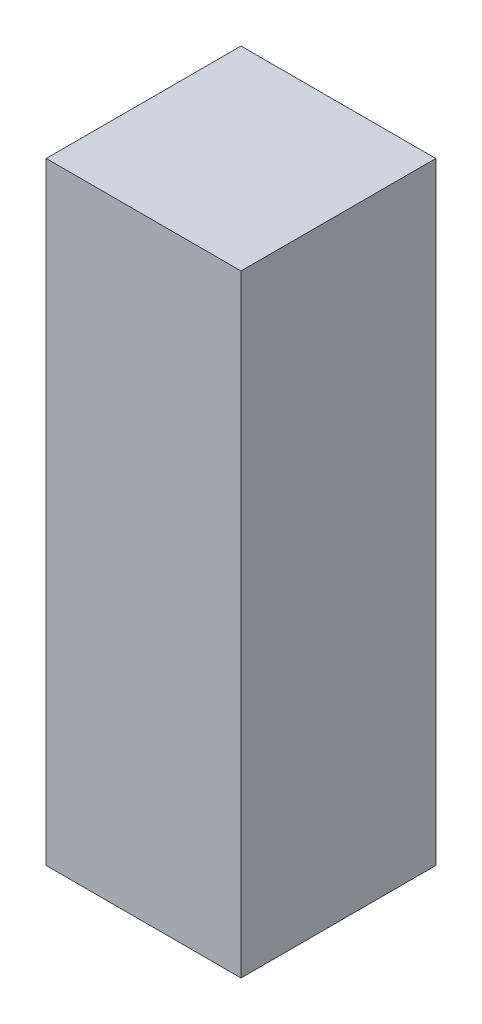
ISO-10303-21;
HEADER;
FILE_DESCRIPTION(('STEP AP214'),'2;1');
FILE_NAME('part.step','',(''),(''),'','','');
FILE_SCHEMA(('AUTOMOTIVE_DESIGN { 1 0 10303 214 1 1 1 1 }'));
ENDSEC;
DATA;
#1=APPLICATION_CONTEXT('core data for automotive mechanical design processes');
#2=APPLICATION_PROTOCOL_DEFINITION('international standard','automotive_design',2000,#1);
#3=PRODUCT_CONTEXT('',#1,'mechanical');
#4=PRODUCT('Part','Part','',(#3));
#5=PRODUCT_RELATED_PRODUCT_CATEGORY('part','',(#4));
#6=PRODUCT_DEFINITION_FORMATION('','',#4);
#7=PRODUCT_DEFINITION_CONTEXT('part definition',#1,'design');
#8=PRODUCT_DEFINITION('design','',#6,#7);
#9=PRODUCT_DEFINITION_SHAPE('','',#8);
#10=(LENGTH_UNIT() NAMED_UNIT(*) SI_UNIT(.MILLI.,.METRE.));
#11=(NAMED_UNIT(*) PLANE_ANGLE_UNIT() SI_UNIT($,.RADIAN.));
#12=(NAMED_UNIT(*) SI_UNIT($,.STERADIAN.) SOLID_ANGLE_UNIT());
#13=UNCERTAINTY_MEASURE_WITH_UNIT(LENGTH_MEASURE(1.E-05),#10,'distance_accuracy_value','');
#14=(GEOMETRIC_REPRESENTATION_CONTEXT(3) GLOBAL_UNCERTAINTY_ASSIGNED_CONTEXT((#13)) GLOBAL_UNIT_ASSIGNED_CONTEXT((#10,
#11,#12)) REPRESENTATION_CONTEXT('',''));
#15=CARTESIAN_POINT('',(0.,0.,0.));
#16=DIRECTION('',(0.,0.,1.));
#17=DIRECTION('',(1.,0.,0.));
#18=AXIS2_PLACEMENT_3D('',#15,#16,#17);
#19=CARTESIAN_POINT('',(0.35,2.2,-0.35));
#20=DIRECTION('',(-1.,0.,0.));
#21=DIRECTION('',(0.,0.,1.));
#22=AXIS2_PLACEMENT_3D('',#19,#20,#21);
#23=PLANE('',#22);
#24=DIRECTION('',(0.,0.,-1.));
#25=VECTOR('',#24,1.);
#26=CARTESIAN_POINT('',(0.35,0.,-0.35));
#27=LINE('',#26,#25);
#28=CARTESIAN_POINT('',(0.35,0.,0.35));
#29=VERTEX_POINT('',#28);
#30=CARTESIAN_POINT('',(0.35,0.,-0.35));
#31=VERTEX_POINT('',#30);
#32=EDGE_CURVE('E104',#29,#31,#27,.T.);
#33=ORIENTED_EDGE('',*,*,#32,.T.);
#34=DIRECTION('',(0.,-1.,0.));
#35=VECTOR('',#34,1.);
#36=CARTESIAN_POINT('',(0.35,2.2,-0.35));
#37=LINE('',#36,#35);
#38=CARTESIAN_POINT('',(0.35,2.2,-0.35));
#39=VERTEX_POINT('',#38);
#40=EDGE_CURVE('E11',#39,#31,#37,.T.);
#41=ORIENTED_EDGE('',*,*,#40,.F.);
#42=DIRECTION('',(0.,0.,-1.));
#43=VECTOR('',#42,1.);
#44=CARTESIAN_POINT('',(0.35,2.2,-0.35));
#45=LINE('',#44,#43);
#46=CARTESIAN_POINT('',(0.35,2.2,0.35));
#47=VERTEX_POINT('',#46);
#48=EDGE_CURVE('E92',#47,#39,#45,.T.);
#49=ORIENTED_EDGE('',*,*,#48,.F.);
#50=DIRECTION('',(0.,-1.,0.));
#51=VECTOR('',#50,1.);
#52=CARTESIAN_POINT('',(0.35,2.2,0.35));
#53=LINE('',#52,#51);
#54=EDGE_CURVE('E100',#47,#29,#53,.T.);
#55=ORIENTED_EDGE('',*,*,#54,.T.);
#56=EDGE_LOOP('',(#33,#41,#49,#55));
#57=FACE_BOUND('',#56,.T.);
#58=ADVANCED_FACE('F41',(#57),#23,.F.);
#59=CARTESIAN_POINT('',(-0.35,2.2,-0.35));
#60=DIRECTION('',(0.,0.,1.));
#61=DIRECTION('',(1.,0.,0.));
#62=AXIS2_PLACEMENT_3D('',#59,#60,#61);
#63=PLANE('',#62);
#64=DIRECTION('',(-1.,0.,0.));
#65=VECTOR('',#64,1.);
#66=CARTESIAN_POINT('',(-0.35,0.,-0.35));
#67=LINE('',#66,#65);
#68=CARTESIAN_POINT('',(-0.35,0.,-0.35));
#69=VERTEX_POINT('',#68);
#70=EDGE_CURVE('E96',#31,#69,#67,.T.);
#71=ORIENTED_EDGE('',*,*,#70,.T.);
#72=DIRECTION('',(0.,-1.,0.));
#73=VECTOR('',#72,1.);
#74=CARTESIAN_POINT('',(-0.35,2.2,-0.35));
#75=LINE('',#74,#73);
#76=CARTESIAN_POINT('',(-0.35,2.2,-0.35));
#77=VERTEX_POINT('',#76);
#78=EDGE_CURVE('E49',#77,#69,#75,.T.);
#79=ORIENTED_EDGE('',*,*,#78,.F.);
#80=DIRECTION('',(-1.,0.,0.));
#81=VECTOR('',#80,1.);
#82=CARTESIAN_POINT('',(-0.35,2.2,-0.35));
#83=LINE('',#82,#81);
#84=EDGE_CURVE('E87',#39,#77,#83,.T.);
#85=ORIENTED_EDGE('',*,*,#84,.F.);
#86=ORIENTED_EDGE('',*,*,#40,.T.);
#87=EDGE_LOOP('',(#71,#79,#85,#86));
#88=FACE_BOUND('',#87,.T.);
#89=ADVANCED_FACE('F95',(#88),#63,.F.);
#90=CARTESIAN_POINT('',(-0.35,2.2,-0.35));
#91=DIRECTION('',(1.,0.,0.));
#92=DIRECTION('',(0.,0.,-1.));
#93=AXIS2_PLACEMENT_3D('',#90,#91,#92);
#94=PLANE('',#93);
#95=DIRECTION('',(0.,0.,1.));
#96=VECTOR('',#95,1.);
#97=CARTESIAN_POINT('',(-0.35,0.,-0.35));
#98=LINE('',#97,#96);
#99=CARTESIAN_POINT('',(-0.35,0.,0.35));
#100=VERTEX_POINT('',#99);
#101=EDGE_CURVE('E74',#69,#100,#98,.T.);
#102=ORIENTED_EDGE('',*,*,#101,.T.);
#103=DIRECTION('',(0.,-1.,0.));
#104=VECTOR('',#103,1.);
#105=CARTESIAN_POINT('',(-0.35,2.2,0.35));
#106=LINE('',#105,#104);
#107=CARTESIAN_POINT('',(-0.35,2.2,0.35));
#108=VERTEX_POINT('',#107);
#109=EDGE_CURVE('E97',#108,#100,#106,.T.);
#110=ORIENTED_EDGE('',*,*,#109,.F.);
#111=DIRECTION('',(0.,0.,1.));
#112=VECTOR('',#111,1.);
#113=CARTESIAN_POINT('',(-0.35,2.2,-0.35));
#114=LINE('',#113,#112);
#115=EDGE_CURVE('E90',#77,#108,#114,.T.);
#116=ORIENTED_EDGE('',*,*,#115,.F.);
#117=ORIENTED_EDGE('',*,*,#78,.T.);
#118=EDGE_LOOP('',(#102,#110,#116,#117));
#119=FACE_BOUND('',#118,.T.);
#120=ADVANCED_FACE('F98',(#119),#94,.F.);
#121=CARTESIAN_POINT('',(-0.35,2.2,0.35));
#122=DIRECTION('',(0.,0.,-1.));
#123=DIRECTION('',(-1.,0.,0.));
#124=AXIS2_PLACEMENT_3D('',#121,#122,#123);
#125=PLANE('',#124);
#126=DIRECTION('',(1.,0.,0.));
#127=VECTOR('',#126,1.);
#128=CARTESIAN_POINT('',(-0.35,0.,0.35));
#129=LINE('',#128,#127);
#130=EDGE_CURVE('E80',#100,#29,#129,.T.);
#131=ORIENTED_EDGE('',*,*,#130,.T.);
#132=ORIENTED_EDGE('',*,*,#54,.F.);
#133=DIRECTION('',(1.,0.,0.));
#134=VECTOR('',#133,1.);
#135=CARTESIAN_POINT('',(-0.35,2.2,0.35));
#136=LINE('',#135,#134);
#137=EDGE_CURVE('E57',#108,#47,#136,.T.);
#138=ORIENTED_EDGE('',*,*,#137,.F.);
#139=ORIENTED_EDGE('',*,*,#109,.T.);
#140=EDGE_LOOP('',(#131,#132,#138,#139));
#141=FACE_BOUND('',#140,.T.);
#142=ADVANCED_FACE('F111',(#141),#125,.F.);
#143=CARTESIAN_POINT('',(0.,2.2,0.));
#144=DIRECTION('',(0.,1.,0.));
#145=DIRECTION('',(0.,0.,1.));
#146=AXIS2_PLACEMENT_3D('',#143,#144,#145);
#147=PLANE('',#146);
#148=ORIENTED_EDGE('',*,*,#48,.T.);
#149=ORIENTED_EDGE('',*,*,#84,.T.);
#150=ORIENTED_EDGE('',*,*,#115,.T.);
#151=ORIENTED_EDGE('',*,*,#137,.T.);
#152=EDGE_LOOP('',(#148,#149,#150,#151));
#153=FACE_BOUND('',#152,.T.);
#154=ADVANCED_FACE('F88',(#153),#147,.T.);
#155=CARTESIAN_POINT('',(0.,0.,0.));
#156=DIRECTION('',(0.,1.,0.));
#157=DIRECTION('',(0.,0.,1.));
#158=AXIS2_PLACEMENT_3D('',#155,#156,#157);
#159=PLANE('',#158);
#160=ORIENTED_EDGE('',*,*,#32,.F.);
#161=ORIENTED_EDGE('',*,*,#130,.F.);
#162=ORIENTED_EDGE('',*,*,#101,.F.);
#163=ORIENTED_EDGE('',*,*,#70,.F.);
#164=EDGE_LOOP('',(#160,#161,#162,#163));
#165=FACE_BOUND('',#164,.T.);
#166=ADVANCED_FACE('F114',(#165),#159,.F.);
#167=CLOSED_SHELL('',(#58,#89,#120,#142,#154,#166));
#168=MANIFOLD_SOLID_BREP('B2',#167);
#169=ADVANCED_BREP_SHAPE_REPRESENTATION('',(#18,#168),#14);
#170=SHAPE_DEFINITION_REPRESENTATION(#9,#169);
ENDSEC;
END-ISO-10303-21;
